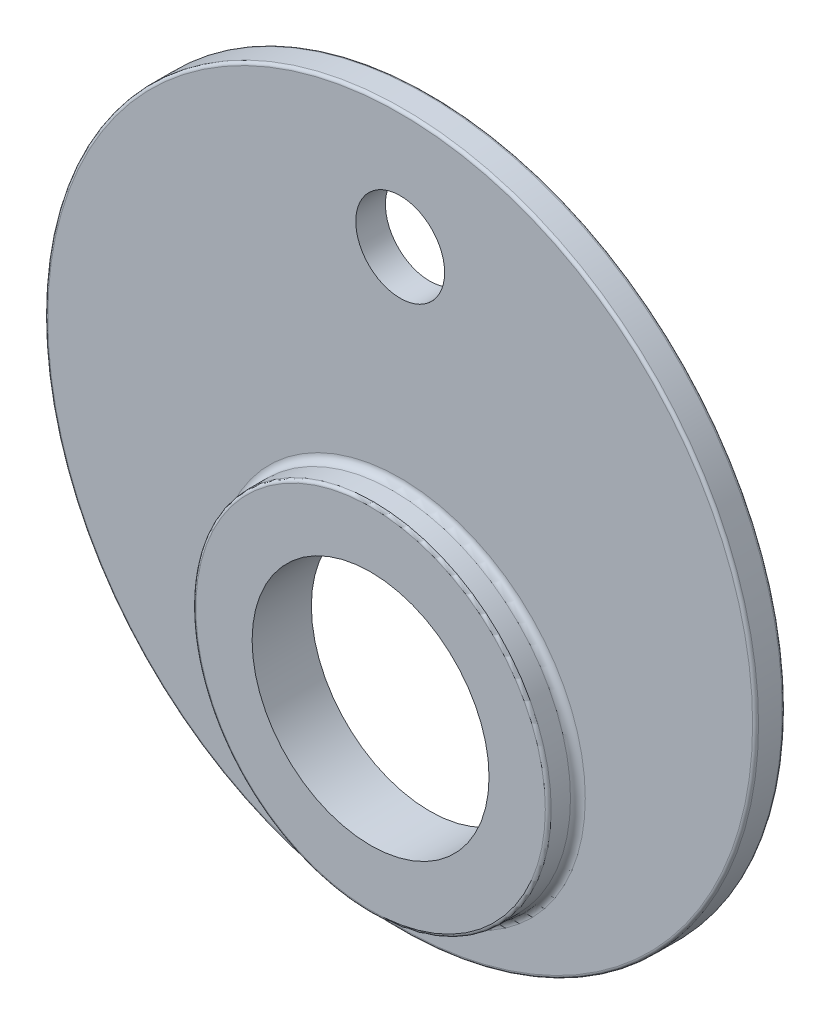
ISO-10303-21;
HEADER;
FILE_DESCRIPTION(('STEP AP214'),'2;1');
FILE_NAME('part.step','',(''),(''),'','','');
FILE_SCHEMA(('AUTOMOTIVE_DESIGN { 1 0 10303 214 1 1 1 1 }'));
ENDSEC;
DATA;
#1=APPLICATION_CONTEXT('core data for automotive mechanical design processes');
#2=APPLICATION_PROTOCOL_DEFINITION('international standard','automotive_design',2000,#1);
#3=PRODUCT_CONTEXT('',#1,'mechanical');
#4=PRODUCT('Part','Part','',(#3));
#5=PRODUCT_RELATED_PRODUCT_CATEGORY('part','',(#4));
#6=PRODUCT_DEFINITION_FORMATION('','',#4);
#7=PRODUCT_DEFINITION_CONTEXT('part definition',#1,'design');
#8=PRODUCT_DEFINITION('design','',#6,#7);
#9=PRODUCT_DEFINITION_SHAPE('','',#8);
#10=(LENGTH_UNIT() NAMED_UNIT(*) SI_UNIT(.MILLI.,.METRE.));
#11=(NAMED_UNIT(*) PLANE_ANGLE_UNIT() SI_UNIT($,.RADIAN.));
#12=(NAMED_UNIT(*) SI_UNIT($,.STERADIAN.) SOLID_ANGLE_UNIT());
#13=UNCERTAINTY_MEASURE_WITH_UNIT(LENGTH_MEASURE(1.E-05),#10,'distance_accuracy_value','');
#14=(GEOMETRIC_REPRESENTATION_CONTEXT(3) GLOBAL_UNCERTAINTY_ASSIGNED_CONTEXT((#13)) GLOBAL_UNIT_ASSIGNED_CONTEXT((#10,
#11,#12)) REPRESENTATION_CONTEXT('',''));
#15=CARTESIAN_POINT('',(0.,0.,0.));
#16=DIRECTION('',(0.,0.,1.));
#17=DIRECTION('',(1.,0.,0.));
#18=AXIS2_PLACEMENT_3D('',#15,#16,#17);
#19=CARTESIAN_POINT('',(0.,0.,25.4));
#20=DIRECTION('',(0.,0.,1.));
#21=DIRECTION('',(1.,0.,0.));
#22=AXIS2_PLACEMENT_3D('',#19,#20,#21);
#23=PLANE('',#22);
#24=CARTESIAN_POINT('',(0.,-127.,25.4));
#25=DIRECTION('',(0.,0.,1.));
#26=DIRECTION('',(1.,0.,0.));
#27=AXIS2_PLACEMENT_3D('',#24,#25,#26);
#28=CIRCLE('',#27,158.75);
#29=CARTESIAN_POINT('',(158.75,-127.,25.4));
#30=VERTEX_POINT('',#29);
#31=EDGE_CURVE('E10',#30,#30,#28,.F.);
#32=ORIENTED_EDGE('',*,*,#31,.T.);
#33=EDGE_LOOP('',(#32));
#34=FACE_BOUND('',#33,.T.);
#35=CARTESIAN_POINT('',(0.,0.,25.4));
#36=DIRECTION('',(0.,0.,1.));
#37=DIRECTION('',(1.,0.,0.));
#38=AXIS2_PLACEMENT_3D('',#35,#36,#37);
#39=CIRCLE('',#38,302.26);
#40=CARTESIAN_POINT('',(302.26,0.,25.4));
#41=VERTEX_POINT('',#40);
#42=EDGE_CURVE('E59',#41,#41,#39,.T.);
#43=ORIENTED_EDGE('',*,*,#42,.T.);
#44=EDGE_LOOP('',(#43));
#45=FACE_BOUND('',#44,.T.);
#46=CARTESIAN_POINT('',(0.,203.2,25.4));
#47=DIRECTION('',(0.,0.,1.));
#48=DIRECTION('',(1.,0.,0.));
#49=AXIS2_PLACEMENT_3D('',#46,#47,#48);
#50=CIRCLE('',#49,38.1);
#51=CARTESIAN_POINT('',(38.1,203.2,25.4));
#52=VERTEX_POINT('',#51);
#53=EDGE_CURVE('E65',#52,#52,#50,.T.);
#54=ORIENTED_EDGE('',*,*,#53,.F.);
#55=EDGE_LOOP('',(#54));
#56=FACE_BOUND('',#55,.T.);
#57=ADVANCED_FACE('F30',(#34,#45,#56),#23,.T.);
#58=CARTESIAN_POINT('',(0.,0.,0.));
#59=DIRECTION('',(0.,0.,1.));
#60=DIRECTION('',(1.,0.,0.));
#61=AXIS2_PLACEMENT_3D('',#58,#59,#60);
#62=PLANE('',#61);
#63=CARTESIAN_POINT('',(0.,0.,0.));
#64=DIRECTION('',(0.,0.,1.));
#65=DIRECTION('',(1.,0.,0.));
#66=AXIS2_PLACEMENT_3D('',#63,#64,#65);
#67=CIRCLE('',#66,302.26);
#68=CARTESIAN_POINT('',(302.26,0.,0.));
#69=VERTEX_POINT('',#68);
#70=EDGE_CURVE('E50',#69,#69,#67,.F.);
#71=ORIENTED_EDGE('',*,*,#70,.T.);
#72=EDGE_LOOP('',(#71));
#73=FACE_BOUND('',#72,.T.);
#74=CARTESIAN_POINT('',(0.,-127.,0.));
#75=DIRECTION('',(0.,0.,1.));
#76=DIRECTION('',(1.,0.,0.));
#77=AXIS2_PLACEMENT_3D('',#74,#75,#76);
#78=CIRCLE('',#77,101.6);
#79=CARTESIAN_POINT('',(101.6,-127.,0.));
#80=VERTEX_POINT('',#79);
#81=EDGE_CURVE('E62',#80,#80,#78,.T.);
#82=ORIENTED_EDGE('',*,*,#81,.T.);
#83=EDGE_LOOP('',(#82));
#84=FACE_BOUND('',#83,.T.);
#85=CARTESIAN_POINT('',(0.,203.2,0.));
#86=DIRECTION('',(0.,0.,1.));
#87=DIRECTION('',(1.,0.,0.));
#88=AXIS2_PLACEMENT_3D('',#85,#86,#87);
#89=CIRCLE('',#88,38.1);
#90=CARTESIAN_POINT('',(38.1,203.2,0.));
#91=VERTEX_POINT('',#90);
#92=EDGE_CURVE('E66',#91,#91,#89,.T.);
#93=ORIENTED_EDGE('',*,*,#92,.T.);
#94=EDGE_LOOP('',(#93));
#95=FACE_BOUND('',#94,.T.);
#96=ADVANCED_FACE('F92',(#73,#84,#95),#62,.F.);
#97=CARTESIAN_POINT('',(0.,0.,25.4));
#98=DIRECTION('',(0.,0.,-1.));
#99=DIRECTION('',(-1.,0.,0.));
#100=AXIS2_PLACEMENT_3D('',#97,#98,#99);
#101=CYLINDRICAL_SURFACE('',#100,304.8);
#102=CARTESIAN_POINT('',(0.,0.,22.86));
#103=DIRECTION('',(0.,0.,1.));
#104=DIRECTION('',(1.,0.,0.));
#105=AXIS2_PLACEMENT_3D('',#102,#103,#104);
#106=CIRCLE('',#105,304.8);
#107=CARTESIAN_POINT('',(304.8,0.,22.86));
#108=VERTEX_POINT('',#107);
#109=EDGE_CURVE('E53',#108,#108,#106,.F.);
#110=ORIENTED_EDGE('',*,*,#109,.T.);
#111=EDGE_LOOP('',(#110));
#112=FACE_BOUND('',#111,.T.);
#113=CARTESIAN_POINT('',(0.,0.,2.54));
#114=DIRECTION('',(0.,0.,1.));
#115=DIRECTION('',(1.,0.,0.));
#116=AXIS2_PLACEMENT_3D('',#113,#114,#115);
#117=CIRCLE('',#116,304.8);
#118=CARTESIAN_POINT('',(304.8,0.,2.54));
#119=VERTEX_POINT('',#118);
#120=EDGE_CURVE('E56',#119,#119,#117,.T.);
#121=ORIENTED_EDGE('',*,*,#120,.T.);
#122=EDGE_LOOP('',(#121));
#123=FACE_BOUND('',#122,.T.);
#124=ADVANCED_FACE('F97',(#112,#123),#101,.T.);
#125=CARTESIAN_POINT('',(0.,-127.,25.4));
#126=DIRECTION('',(0.,0.,-1.));
#127=DIRECTION('',(-1.,0.,0.));
#128=AXIS2_PLACEMENT_3D('',#125,#126,#127);
#129=CYLINDRICAL_SURFACE('',#128,101.6);
#130=ORIENTED_EDGE('',*,*,#81,.F.);
#131=EDGE_LOOP('',(#130));
#132=FACE_BOUND('',#131,.T.);
#133=CARTESIAN_POINT('',(0.,-127.,50.8));
#134=DIRECTION('',(0.,0.,1.));
#135=DIRECTION('',(1.,0.,0.));
#136=AXIS2_PLACEMENT_3D('',#133,#134,#135);
#137=CIRCLE('',#136,101.6);
#138=CARTESIAN_POINT('',(101.6,-127.,50.8));
#139=VERTEX_POINT('',#138);
#140=EDGE_CURVE('E69',#139,#139,#137,.T.);
#141=ORIENTED_EDGE('',*,*,#140,.T.);
#142=EDGE_LOOP('',(#141));
#143=FACE_BOUND('',#142,.T.);
#144=ADVANCED_FACE('F75',(#132,#143),#129,.F.);
#145=CARTESIAN_POINT('',(0.,203.2,25.4));
#146=DIRECTION('',(0.,0.,-1.));
#147=DIRECTION('',(-1.,0.,0.));
#148=AXIS2_PLACEMENT_3D('',#145,#146,#147);
#149=CYLINDRICAL_SURFACE('',#148,38.1);
#150=ORIENTED_EDGE('',*,*,#53,.T.);
#151=EDGE_LOOP('',(#150));
#152=FACE_BOUND('',#151,.T.);
#153=ORIENTED_EDGE('',*,*,#92,.F.);
#154=EDGE_LOOP('',(#153));
#155=FACE_BOUND('',#154,.T.);
#156=ADVANCED_FACE('F80',(#152,#155),#149,.F.);
#157=CARTESIAN_POINT('',(0.,-127.,50.8));
#158=DIRECTION('',(0.,0.,1.));
#159=DIRECTION('',(1.,0.,0.));
#160=AXIS2_PLACEMENT_3D('',#157,#158,#159);
#161=PLANE('',#160);
#162=CARTESIAN_POINT('',(0.,-127.,50.8));
#163=DIRECTION('',(0.,0.,1.));
#164=DIRECTION('',(1.,0.,0.));
#165=AXIS2_PLACEMENT_3D('',#162,#163,#164);
#166=CIRCLE('',#165,149.86);
#167=CARTESIAN_POINT('',(149.86,-127.,50.8));
#168=VERTEX_POINT('',#167);
#169=EDGE_CURVE('E45',#168,#168,#166,.T.);
#170=ORIENTED_EDGE('',*,*,#169,.T.);
#171=EDGE_LOOP('',(#170));
#172=FACE_BOUND('',#171,.T.);
#173=ORIENTED_EDGE('',*,*,#140,.F.);
#174=EDGE_LOOP('',(#173));
#175=FACE_BOUND('',#174,.T.);
#176=ADVANCED_FACE('F77',(#172,#175),#161,.T.);
#177=CARTESIAN_POINT('',(0.,-127.,50.8));
#178=DIRECTION('',(0.,0.,-1.));
#179=DIRECTION('',(-1.,0.,0.));
#180=AXIS2_PLACEMENT_3D('',#177,#178,#179);
#181=CYLINDRICAL_SURFACE('',#180,152.4);
#182=CARTESIAN_POINT('',(0.,-127.,31.75));
#183=DIRECTION('',(0.,0.,1.));
#184=DIRECTION('',(1.,0.,0.));
#185=AXIS2_PLACEMENT_3D('',#182,#183,#184);
#186=CIRCLE('',#185,152.4);
#187=CARTESIAN_POINT('',(152.4,-127.,31.75));
#188=VERTEX_POINT('',#187);
#189=EDGE_CURVE('E37',#188,#188,#186,.T.);
#190=ORIENTED_EDGE('',*,*,#189,.T.);
#191=EDGE_LOOP('',(#190));
#192=FACE_BOUND('',#191,.T.);
#193=CARTESIAN_POINT('',(0.,-127.,48.26));
#194=DIRECTION('',(0.,0.,1.));
#195=DIRECTION('',(1.,0.,0.));
#196=AXIS2_PLACEMENT_3D('',#193,#194,#195);
#197=CIRCLE('',#196,152.4);
#198=CARTESIAN_POINT('',(152.4,-127.,48.26));
#199=VERTEX_POINT('',#198);
#200=EDGE_CURVE('E41',#199,#199,#197,.F.);
#201=ORIENTED_EDGE('',*,*,#200,.T.);
#202=EDGE_LOOP('',(#201));
#203=FACE_BOUND('',#202,.T.);
#204=ADVANCED_FACE('F79',(#192,#203),#181,.T.);
#205=CARTESIAN_POINT('',(0.,0.,22.86));
#206=DIRECTION('',(0.,0.,1.));
#207=DIRECTION('',(1.,0.,0.));
#208=AXIS2_PLACEMENT_3D('',#205,#206,#207);
#209=TOROIDAL_SURFACE('',#208,302.26,2.54);
#210=ORIENTED_EDGE('',*,*,#109,.F.);
#211=EDGE_LOOP('',(#210));
#212=FACE_BOUND('',#211,.T.);
#213=ORIENTED_EDGE('',*,*,#42,.F.);
#214=EDGE_LOOP('',(#213));
#215=FACE_BOUND('',#214,.T.);
#216=ADVANCED_FACE('F87',(#212,#215),#209,.T.);
#217=CARTESIAN_POINT('',(0.,0.,2.54));
#218=DIRECTION('',(0.,0.,1.));
#219=DIRECTION('',(1.,0.,0.));
#220=AXIS2_PLACEMENT_3D('',#217,#218,#219);
#221=TOROIDAL_SURFACE('',#220,302.26,2.54);
#222=ORIENTED_EDGE('',*,*,#70,.F.);
#223=EDGE_LOOP('',(#222));
#224=FACE_BOUND('',#223,.T.);
#225=ORIENTED_EDGE('',*,*,#120,.F.);
#226=EDGE_LOOP('',(#225));
#227=FACE_BOUND('',#226,.T.);
#228=ADVANCED_FACE('F108',(#224,#227),#221,.T.);
#229=CARTESIAN_POINT('',(0.,-127.,48.26));
#230=DIRECTION('',(0.,0.,1.));
#231=DIRECTION('',(1.,0.,0.));
#232=AXIS2_PLACEMENT_3D('',#229,#230,#231);
#233=TOROIDAL_SURFACE('',#232,149.86,2.54);
#234=ORIENTED_EDGE('',*,*,#200,.F.);
#235=EDGE_LOOP('',(#234));
#236=FACE_BOUND('',#235,.T.);
#237=ORIENTED_EDGE('',*,*,#169,.F.);
#238=EDGE_LOOP('',(#237));
#239=FACE_BOUND('',#238,.T.);
#240=ADVANCED_FACE('F111',(#236,#239),#233,.T.);
#241=CARTESIAN_POINT('',(0.,-127.,31.75));
#242=DIRECTION('',(0.,0.,1.));
#243=DIRECTION('',(1.,0.,0.));
#244=AXIS2_PLACEMENT_3D('',#241,#242,#243);
#245=TOROIDAL_SURFACE('',#244,158.75,6.35);
#246=ORIENTED_EDGE('',*,*,#31,.F.);
#247=EDGE_LOOP('',(#246));
#248=FACE_BOUND('',#247,.T.);
#249=ORIENTED_EDGE('',*,*,#189,.F.);
#250=EDGE_LOOP('',(#249));
#251=FACE_BOUND('',#250,.T.);
#252=ADVANCED_FACE('F32',(#248,#251),#245,.F.);
#253=CLOSED_SHELL('',(#57,#96,#124,#144,#156,#176,#204,#216,#228,#240,#252));
#254=MANIFOLD_SOLID_BREP('B2',#253);
#255=ADVANCED_BREP_SHAPE_REPRESENTATION('',(#18,#254),#14);
#256=SHAPE_DEFINITION_REPRESENTATION(#9,#255);
ENDSEC;
END-ISO-10303-21;
